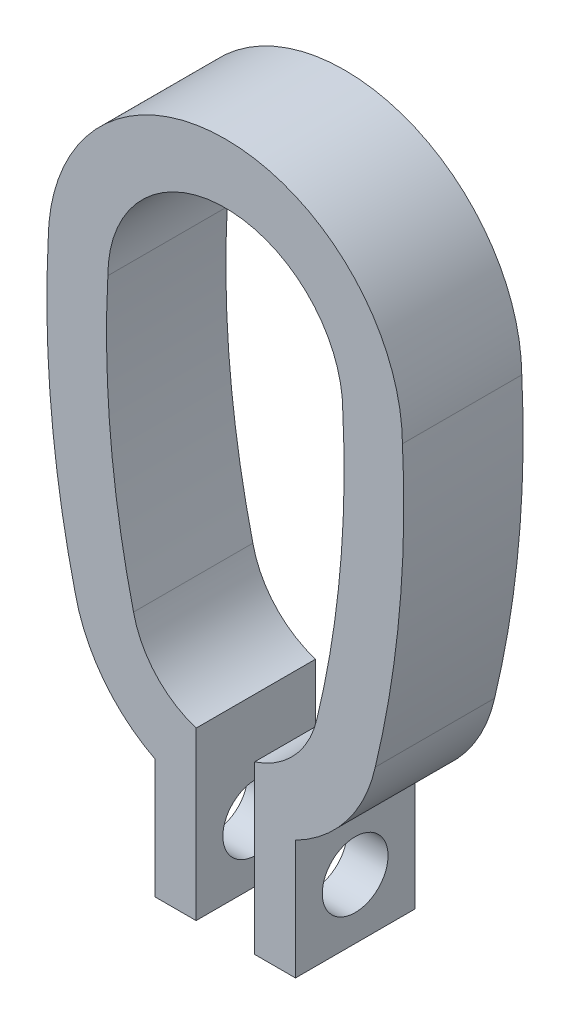
ISO-10303-21;
HEADER;
FILE_DESCRIPTION(('STEP AP214'),'2;1');
FILE_NAME('part.step','',(''),(''),'','','');
FILE_SCHEMA(('AUTOMOTIVE_DESIGN { 1 0 10303 214 1 1 1 1 }'));
ENDSEC;
DATA;
#1=APPLICATION_CONTEXT('core data for automotive mechanical design processes');
#2=APPLICATION_PROTOCOL_DEFINITION('international standard','automotive_design',2000,#1);
#3=PRODUCT_CONTEXT('',#1,'mechanical');
#4=PRODUCT('Part','Part','',(#3));
#5=PRODUCT_RELATED_PRODUCT_CATEGORY('part','',(#4));
#6=PRODUCT_DEFINITION_FORMATION('','',#4);
#7=PRODUCT_DEFINITION_CONTEXT('part definition',#1,'design');
#8=PRODUCT_DEFINITION('design','',#6,#7);
#9=PRODUCT_DEFINITION_SHAPE('','',#8);
#10=(LENGTH_UNIT() NAMED_UNIT(*) SI_UNIT(.MILLI.,.METRE.));
#11=(NAMED_UNIT(*) PLANE_ANGLE_UNIT() SI_UNIT($,.RADIAN.));
#12=(NAMED_UNIT(*) SI_UNIT($,.STERADIAN.) SOLID_ANGLE_UNIT());
#13=UNCERTAINTY_MEASURE_WITH_UNIT(LENGTH_MEASURE(1.E-05),#10,'distance_accuracy_value','');
#14=(GEOMETRIC_REPRESENTATION_CONTEXT(3) GLOBAL_UNCERTAINTY_ASSIGNED_CONTEXT((#13)) GLOBAL_UNIT_ASSIGNED_CONTEXT((#10,
#11,#12)) REPRESENTATION_CONTEXT('',''));
#15=CARTESIAN_POINT('',(0.,0.,0.));
#16=DIRECTION('',(0.,0.,1.));
#17=DIRECTION('',(1.,0.,0.));
#18=AXIS2_PLACEMENT_3D('',#15,#16,#17);
#19=CARTESIAN_POINT('',(0.,-27.4999999999599,12.7));
#20=DIRECTION('',(0.,0.,-1.));
#21=DIRECTION('',(-1.,0.,0.));
#22=AXIS2_PLACEMENT_3D('',#19,#20,#21);
#23=CYLINDRICAL_SURFACE('',#22,10.);
#24=CARTESIAN_POINT('',(0.,-27.4999999999599,0.));
#25=DIRECTION('',(0.,0.,-1.));
#26=DIRECTION('',(1.,0.,0.));
#27=AXIS2_PLACEMENT_3D('',#24,#25,#26);
#28=CIRCLE('',#27,10.);
#29=CARTESIAN_POINT('',(9.76853613803451,-29.639088992946,0.));
#30=VERTEX_POINT('',#29);
#31=CARTESIAN_POINT('',(3.1103074015303,-37.0039985199506,0.));
#32=VERTEX_POINT('',#31);
#33=EDGE_CURVE('E195',#30,#32,#28,.T.);
#34=ORIENTED_EDGE('',*,*,#33,.T.);
#35=DIRECTION('',(0.,0.,-1.));
#36=VECTOR('',#35,1.);
#37=CARTESIAN_POINT('',(3.1103074015303,-37.0039985199506,12.7));
#38=LINE('',#37,#36);
#39=CARTESIAN_POINT('',(3.1103074015303,-37.0039985199506,12.7));
#40=VERTEX_POINT('',#39);
#41=EDGE_CURVE('E11',#40,#32,#38,.T.);
#42=ORIENTED_EDGE('',*,*,#41,.F.);
#43=CARTESIAN_POINT('',(0.,-27.4999999999599,12.7));
#44=DIRECTION('',(0.,0.,-1.));
#45=DIRECTION('',(1.,0.,0.));
#46=AXIS2_PLACEMENT_3D('',#43,#44,#45);
#47=CIRCLE('',#46,10.);
#48=CARTESIAN_POINT('',(9.76853613803451,-29.639088992946,12.7));
#49=VERTEX_POINT('',#48);
#50=EDGE_CURVE('E242',#49,#40,#47,.T.);
#51=ORIENTED_EDGE('',*,*,#50,.F.);
#52=DIRECTION('',(0.,0.,-1.));
#53=VECTOR('',#52,1.);
#54=CARTESIAN_POINT('',(9.76853613803451,-29.639088992946,12.7));
#55=LINE('',#54,#53);
#56=EDGE_CURVE('E188',#49,#30,#55,.T.);
#57=ORIENTED_EDGE('',*,*,#56,.T.);
#58=EDGE_LOOP('',(#34,#42,#51,#57));
#59=FACE_BOUND('',#58,.T.);
#60=ADVANCED_FACE('F42',(#59),#23,.F.);
#61=CARTESIAN_POINT('',(3.1103074015303,-37.0039985199506,12.7));
#62=DIRECTION('',(1.,0.,0.));
#63=DIRECTION('',(0.,1.,0.));
#64=AXIS2_PLACEMENT_3D('',#61,#62,#63);
#65=PLANE('',#64);
#66=CARTESIAN_POINT('',(3.1103074015303,-48.3962280050505,6.35));
#67=DIRECTION('',(1.,0.,0.));
#68=DIRECTION('',(0.,1.,0.));
#69=AXIS2_PLACEMENT_3D('',#66,#67,#68);
#70=CIRCLE('',#69,3.499999985);
#71=CARTESIAN_POINT('',(3.1103074015303,-44.8962280200505,6.35));
#72=VERTEX_POINT('',#71);
#73=EDGE_CURVE('E200',#72,#72,#70,.T.);
#74=ORIENTED_EDGE('',*,*,#73,.T.);
#75=EDGE_LOOP('',(#74));
#76=FACE_BOUND('',#75,.T.);
#77=DIRECTION('',(0.,-1.,0.));
#78=VECTOR('',#77,1.);
#79=CARTESIAN_POINT('',(3.1103074015303,-37.0039985199506,0.));
#80=LINE('',#79,#78);
#81=CARTESIAN_POINT('',(3.11030740153029,-54.7462280050505,0.));
#82=VERTEX_POINT('',#81);
#83=EDGE_CURVE('E196',#32,#82,#80,.T.);
#84=ORIENTED_EDGE('',*,*,#83,.T.);
#85=DIRECTION('',(0.,0.,-1.));
#86=VECTOR('',#85,1.);
#87=CARTESIAN_POINT('',(3.11030740153029,-54.7462280050505,12.7));
#88=LINE('',#87,#86);
#89=CARTESIAN_POINT('',(3.11030740153029,-54.7462280050505,12.7));
#90=VERTEX_POINT('',#89);
#91=EDGE_CURVE('E53',#90,#82,#88,.T.);
#92=ORIENTED_EDGE('',*,*,#91,.F.);
#93=DIRECTION('',(0.,-1.,0.));
#94=VECTOR('',#93,1.);
#95=CARTESIAN_POINT('',(3.1103074015303,-37.0039985199506,12.7));
#96=LINE('',#95,#94);
#97=EDGE_CURVE('E129',#40,#90,#96,.T.);
#98=ORIENTED_EDGE('',*,*,#97,.F.);
#99=ORIENTED_EDGE('',*,*,#41,.T.);
#100=EDGE_LOOP('',(#84,#92,#98,#99));
#101=FACE_BOUND('',#100,.T.);
#102=ADVANCED_FACE('F365',(#76,#101),#65,.F.);
#103=CARTESIAN_POINT('',(3.11030740153029,-54.7462280050505,12.7));
#104=DIRECTION('',(0.,1.,0.));
#105=DIRECTION('',(0.,0.,1.));
#106=AXIS2_PLACEMENT_3D('',#103,#104,#105);
#107=PLANE('',#106);
#108=DIRECTION('',(1.,0.,0.));
#109=VECTOR('',#108,1.);
#110=CARTESIAN_POINT('',(3.11030740153029,-54.7462280050505,0.));
#111=LINE('',#110,#109);
#112=CARTESIAN_POINT('',(7.46523615325854,-54.7462280050505,0.));
#113=VERTEX_POINT('',#112);
#114=EDGE_CURVE('E205',#82,#113,#111,.T.);
#115=ORIENTED_EDGE('',*,*,#114,.T.);
#116=DIRECTION('',(0.,0.,-1.));
#117=VECTOR('',#116,1.);
#118=CARTESIAN_POINT('',(7.46523615325854,-54.7462280050505,12.7));
#119=LINE('',#118,#117);
#120=CARTESIAN_POINT('',(7.46523615325854,-54.7462280050505,12.7));
#121=VERTEX_POINT('',#120);
#122=EDGE_CURVE('E281',#121,#113,#119,.T.);
#123=ORIENTED_EDGE('',*,*,#122,.F.);
#124=DIRECTION('',(1.,0.,0.));
#125=VECTOR('',#124,1.);
#126=CARTESIAN_POINT('',(3.11030740153029,-54.7462280050505,12.7));
#127=LINE('',#126,#125);
#128=EDGE_CURVE('E293',#90,#121,#127,.T.);
#129=ORIENTED_EDGE('',*,*,#128,.F.);
#130=ORIENTED_EDGE('',*,*,#91,.T.);
#131=EDGE_LOOP('',(#115,#123,#129,#130));
#132=FACE_BOUND('',#131,.T.);
#133=ADVANCED_FACE('F291',(#132),#107,.F.);
#134=CARTESIAN_POINT('',(7.46523615325854,-54.7462280050505,12.7));
#135=DIRECTION('',(-1.,0.,0.));
#136=DIRECTION('',(0.,-1.,0.));
#137=AXIS2_PLACEMENT_3D('',#134,#135,#136);
#138=PLANE('',#137);
#139=CARTESIAN_POINT('',(7.46523615325854,-48.3962280050505,6.35));
#140=DIRECTION('',(1.,0.,0.));
#141=DIRECTION('',(0.,1.,0.));
#142=AXIS2_PLACEMENT_3D('',#139,#140,#141);
#143=CIRCLE('',#142,3.499999985);
#144=CARTESIAN_POINT('',(7.46523615325854,-44.8962280200505,6.35));
#145=VERTEX_POINT('',#144);
#146=EDGE_CURVE('E465',#145,#145,#143,.T.);
#147=ORIENTED_EDGE('',*,*,#146,.F.);
#148=EDGE_LOOP('',(#147));
#149=FACE_BOUND('',#148,.T.);
#150=DIRECTION('',(0.,1.,0.));
#151=VECTOR('',#150,1.);
#152=CARTESIAN_POINT('',(7.46523615325854,-54.7462280050505,0.));
#153=LINE('',#152,#151);
#154=CARTESIAN_POINT('',(7.46523615325853,-42.0462280050505,0.));
#155=VERTEX_POINT('',#154);
#156=EDGE_CURVE('E202',#113,#155,#153,.T.);
#157=ORIENTED_EDGE('',*,*,#156,.T.);
#158=DIRECTION('',(0.,0.,-1.));
#159=VECTOR('',#158,1.);
#160=CARTESIAN_POINT('',(7.46523615325853,-42.0462280050505,12.7));
#161=LINE('',#160,#159);
#162=CARTESIAN_POINT('',(7.46523615325853,-42.0462280050505,12.7));
#163=VERTEX_POINT('',#162);
#164=EDGE_CURVE('E278',#163,#155,#161,.T.);
#165=ORIENTED_EDGE('',*,*,#164,.F.);
#166=DIRECTION('',(0.,1.,0.));
#167=VECTOR('',#166,1.);
#168=CARTESIAN_POINT('',(7.46523615325854,-54.7462280050505,12.7));
#169=LINE('',#168,#167);
#170=EDGE_CURVE('E314',#121,#163,#169,.T.);
#171=ORIENTED_EDGE('',*,*,#170,.F.);
#172=ORIENTED_EDGE('',*,*,#122,.T.);
#173=EDGE_LOOP('',(#157,#165,#171,#172));
#174=FACE_BOUND('',#173,.T.);
#175=ADVANCED_FACE('F305',(#149,#174),#138,.F.);
#176=CARTESIAN_POINT('',(0.,-27.4999999999599,12.7));
#177=DIRECTION('',(0.,0.,-1.));
#178=DIRECTION('',(-1.,0.,0.));
#179=AXIS2_PLACEMENT_3D('',#176,#177,#178);
#180=CYLINDRICAL_SURFACE('',#179,16.35);
#181=CARTESIAN_POINT('',(0.,-27.4999999999599,0.));
#182=DIRECTION('',(0.,0.,1.));
#183=DIRECTION('',(1.,0.,0.));
#184=AXIS2_PLACEMENT_3D('',#181,#182,#183);
#185=CIRCLE('',#184,16.35);
#186=CARTESIAN_POINT('',(15.9560828435937,-31.0673407866491,0.));
#187=VERTEX_POINT('',#186);
#188=EDGE_CURVE('E208',#155,#187,#185,.T.);
#189=ORIENTED_EDGE('',*,*,#188,.T.);
#190=DIRECTION('',(0.,0.,-1.));
#191=VECTOR('',#190,1.);
#192=CARTESIAN_POINT('',(15.9560828435937,-31.0673407866491,12.7));
#193=LINE('',#192,#191);
#194=CARTESIAN_POINT('',(15.9560828435937,-31.0673407866491,12.7));
#195=VERTEX_POINT('',#194);
#196=EDGE_CURVE('E277',#195,#187,#193,.T.);
#197=ORIENTED_EDGE('',*,*,#196,.F.);
#198=CARTESIAN_POINT('',(0.,-27.4999999999599,12.7));
#199=DIRECTION('',(0.,0.,1.));
#200=DIRECTION('',(1.,0.,0.));
#201=AXIS2_PLACEMENT_3D('',#198,#199,#200);
#202=CIRCLE('',#201,16.35);
#203=EDGE_CURVE('E309',#163,#195,#202,.T.);
#204=ORIENTED_EDGE('',*,*,#203,.F.);
#205=ORIENTED_EDGE('',*,*,#164,.T.);
#206=EDGE_LOOP('',(#189,#197,#204,#205));
#207=FACE_BOUND('',#206,.T.);
#208=ADVANCED_FACE('F306',(#207),#180,.T.);
#209=CARTESIAN_POINT('',(-91.0364026495912,-5.40375257091586,12.7));
#210=DIRECTION('',(0.,0.,-1.));
#211=DIRECTION('',(-1.,0.,0.));
#212=AXIS2_PLACEMENT_3D('',#209,#210,#211);
#213=CYLINDRICAL_SURFACE('',#212,110.027322570878);
#214=CARTESIAN_POINT('',(-91.0364026495912,-5.40375257091586,0.));
#215=DIRECTION('',(0.,0.,1.));
#216=DIRECTION('',(-1.,0.,0.));
#217=AXIS2_PLACEMENT_3D('',#214,#215,#216);
#218=CIRCLE('',#217,110.027322570878);
#219=CARTESIAN_POINT('',(18.8491397086616,0.180089542606383,0.));
#220=VERTEX_POINT('',#219);
#221=EDGE_CURVE('E211',#187,#220,#218,.T.);
#222=ORIENTED_EDGE('',*,*,#221,.T.);
#223=DIRECTION('',(0.,0.,-1.));
#224=VECTOR('',#223,1.);
#225=CARTESIAN_POINT('',(18.8491397086616,0.180089542606383,12.7));
#226=LINE('',#225,#224);
#227=CARTESIAN_POINT('',(18.8491397086616,0.180089542606383,12.7));
#228=VERTEX_POINT('',#227);
#229=EDGE_CURVE('E275',#228,#220,#226,.T.);
#230=ORIENTED_EDGE('',*,*,#229,.F.);
#231=CARTESIAN_POINT('',(-91.0364026495912,-5.40375257091586,12.7));
#232=DIRECTION('',(0.,0.,1.));
#233=DIRECTION('',(-1.,0.,0.));
#234=AXIS2_PLACEMENT_3D('',#231,#232,#233);
#235=CIRCLE('',#234,110.027322570878);
#236=EDGE_CURVE('E311',#195,#228,#235,.T.);
#237=ORIENTED_EDGE('',*,*,#236,.F.);
#238=ORIENTED_EDGE('',*,*,#196,.T.);
#239=EDGE_LOOP('',(#222,#230,#237,#238));
#240=FACE_BOUND('',#239,.T.);
#241=ADVANCED_FACE('F381',(#240),#213,.T.);
#242=CARTESIAN_POINT('',(0.,0.,12.7));
#243=DIRECTION('',(0.,0.,-1.));
#244=DIRECTION('',(-1.,0.,0.));
#245=AXIS2_PLACEMENT_3D('',#242,#243,#244);
#246=CYLINDRICAL_SURFACE('',#245,18.85);
#247=CARTESIAN_POINT('',(0.,0.,0.));
#248=DIRECTION('',(0.,0.,1.));
#249=DIRECTION('',(1.,0.,0.));
#250=AXIS2_PLACEMENT_3D('',#247,#248,#249);
#251=CIRCLE('',#250,18.85);
#252=CARTESIAN_POINT('',(-18.8491397086616,0.180089542604985,0.));
#253=VERTEX_POINT('',#252);
#254=EDGE_CURVE('E212',#220,#253,#251,.T.);
#255=ORIENTED_EDGE('',*,*,#254,.T.);
#256=DIRECTION('',(0.,0.,-1.));
#257=VECTOR('',#256,1.);
#258=CARTESIAN_POINT('',(-18.8491397086616,0.180089542604985,12.7));
#259=LINE('',#258,#257);
#260=CARTESIAN_POINT('',(-18.8491397086616,0.180089542604985,12.7));
#261=VERTEX_POINT('',#260);
#262=EDGE_CURVE('E268',#261,#253,#259,.T.);
#263=ORIENTED_EDGE('',*,*,#262,.F.);
#264=CARTESIAN_POINT('',(0.,0.,12.7));
#265=DIRECTION('',(0.,0.,1.));
#266=DIRECTION('',(1.,0.,0.));
#267=AXIS2_PLACEMENT_3D('',#264,#265,#266);
#268=CIRCLE('',#267,18.85);
#269=EDGE_CURVE('E318',#228,#261,#268,.T.);
#270=ORIENTED_EDGE('',*,*,#269,.F.);
#271=ORIENTED_EDGE('',*,*,#229,.T.);
#272=EDGE_LOOP('',(#255,#263,#270,#271));
#273=FACE_BOUND('',#272,.T.);
#274=ADVANCED_FACE('F383',(#273),#246,.T.);
#275=CARTESIAN_POINT('',(91.0364026495912,-5.40375257091582,12.7));
#276=DIRECTION('',(0.,0.,-1.));
#277=DIRECTION('',(-1.,0.,0.));
#278=AXIS2_PLACEMENT_3D('',#275,#276,#277);
#279=CYLINDRICAL_SURFACE('',#278,110.027322570878);
#280=CARTESIAN_POINT('',(91.0364026495912,-5.40375257091582,0.));
#281=DIRECTION('',(0.,0.,1.));
#282=DIRECTION('',(1.,0.,0.));
#283=AXIS2_PLACEMENT_3D('',#280,#281,#282);
#284=CIRCLE('',#283,110.027322570878);
#285=CARTESIAN_POINT('',(-15.9560828435952,-31.0673407866425,0.));
#286=VERTEX_POINT('',#285);
#287=EDGE_CURVE('E220',#253,#286,#284,.T.);
#288=ORIENTED_EDGE('',*,*,#287,.T.);
#289=DIRECTION('',(0.,0.,-1.));
#290=VECTOR('',#289,1.);
#291=CARTESIAN_POINT('',(-15.9560828435952,-31.0673407866425,12.7));
#292=LINE('',#291,#290);
#293=CARTESIAN_POINT('',(-15.9560828435952,-31.0673407866425,12.7));
#294=VERTEX_POINT('',#293);
#295=EDGE_CURVE('E262',#294,#286,#292,.T.);
#296=ORIENTED_EDGE('',*,*,#295,.F.);
#297=CARTESIAN_POINT('',(91.0364026495912,-5.40375257091582,12.7));
#298=DIRECTION('',(0.,0.,1.));
#299=DIRECTION('',(1.,0.,0.));
#300=AXIS2_PLACEMENT_3D('',#297,#298,#299);
#301=CIRCLE('',#300,110.027322570878);
#302=EDGE_CURVE('E324',#261,#294,#301,.T.);
#303=ORIENTED_EDGE('',*,*,#302,.F.);
#304=ORIENTED_EDGE('',*,*,#262,.T.);
#305=EDGE_LOOP('',(#288,#296,#303,#304));
#306=FACE_BOUND('',#305,.T.);
#307=ADVANCED_FACE('F389',(#306),#279,.T.);
#308=CARTESIAN_POINT('',(0.,-27.4999999999599,12.7));
#309=DIRECTION('',(0.,0.,-1.));
#310=DIRECTION('',(-1.,0.,0.));
#311=AXIS2_PLACEMENT_3D('',#308,#309,#310);
#312=CYLINDRICAL_SURFACE('',#311,16.3500000000001);
#313=CARTESIAN_POINT('',(0.,-27.4999999999599,0.));
#314=DIRECTION('',(0.,0.,1.));
#315=DIRECTION('',(1.,0.,0.));
#316=AXIS2_PLACEMENT_3D('',#313,#314,#315);
#317=CIRCLE('',#316,16.3500000000001);
#318=CARTESIAN_POINT('',(-7.46523615327629,-42.0462280050414,0.));
#319=VERTEX_POINT('',#318);
#320=EDGE_CURVE('E219',#286,#319,#317,.T.);
#321=ORIENTED_EDGE('',*,*,#320,.T.);
#322=DIRECTION('',(0.,0.,-1.));
#323=VECTOR('',#322,1.);
#324=CARTESIAN_POINT('',(-7.46523615327629,-42.0462280050414,12.7));
#325=LINE('',#324,#323);
#326=CARTESIAN_POINT('',(-7.46523615327629,-42.0462280050414,12.7));
#327=VERTEX_POINT('',#326);
#328=EDGE_CURVE('E257',#327,#319,#325,.T.);
#329=ORIENTED_EDGE('',*,*,#328,.F.);
#330=CARTESIAN_POINT('',(0.,-27.4999999999599,12.7));
#331=DIRECTION('',(0.,0.,1.));
#332=DIRECTION('',(1.,0.,0.));
#333=AXIS2_PLACEMENT_3D('',#330,#331,#332);
#334=CIRCLE('',#333,16.3500000000001);
#335=EDGE_CURVE('E327',#294,#327,#334,.T.);
#336=ORIENTED_EDGE('',*,*,#335,.F.);
#337=ORIENTED_EDGE('',*,*,#295,.T.);
#338=EDGE_LOOP('',(#321,#329,#336,#337));
#339=FACE_BOUND('',#338,.T.);
#340=ADVANCED_FACE('F395',(#339),#312,.T.);
#341=CARTESIAN_POINT('',(-7.46523615327631,-54.7462280050505,12.7));
#342=DIRECTION('',(1.,0.,0.));
#343=DIRECTION('',(0.,1.,0.));
#344=AXIS2_PLACEMENT_3D('',#341,#342,#343);
#345=PLANE('',#344);
#346=CARTESIAN_POINT('',(-7.46523615327629,-48.3962280050505,6.35));
#347=DIRECTION('',(1.,0.,0.));
#348=DIRECTION('',(0.,1.,0.));
#349=AXIS2_PLACEMENT_3D('',#346,#347,#348);
#350=CIRCLE('',#349,3.499999985);
#351=CARTESIAN_POINT('',(-7.46523615327629,-44.8962280200505,6.35));
#352=VERTEX_POINT('',#351);
#353=EDGE_CURVE('E463',#352,#352,#350,.T.);
#354=ORIENTED_EDGE('',*,*,#353,.T.);
#355=EDGE_LOOP('',(#354));
#356=FACE_BOUND('',#355,.T.);
#357=DIRECTION('',(0.,-1.,0.));
#358=VECTOR('',#357,1.);
#359=CARTESIAN_POINT('',(-7.46523615327631,-54.7462280050505,0.));
#360=LINE('',#359,#358);
#361=CARTESIAN_POINT('',(-7.46523615327631,-54.7462280050505,0.));
#362=VERTEX_POINT('',#361);
#363=EDGE_CURVE('E224',#319,#362,#360,.T.);
#364=ORIENTED_EDGE('',*,*,#363,.T.);
#365=DIRECTION('',(0.,0.,-1.));
#366=VECTOR('',#365,1.);
#367=CARTESIAN_POINT('',(-7.46523615327631,-54.7462280050505,12.7));
#368=LINE('',#367,#366);
#369=CARTESIAN_POINT('',(-7.46523615327631,-54.7462280050505,12.7));
#370=VERTEX_POINT('',#369);
#371=EDGE_CURVE('E258',#370,#362,#368,.T.);
#372=ORIENTED_EDGE('',*,*,#371,.F.);
#373=DIRECTION('',(0.,-1.,0.));
#374=VECTOR('',#373,1.);
#375=CARTESIAN_POINT('',(-7.46523615327631,-54.7462280050505,12.7));
#376=LINE('',#375,#374);
#377=EDGE_CURVE('E332',#327,#370,#376,.T.);
#378=ORIENTED_EDGE('',*,*,#377,.F.);
#379=ORIENTED_EDGE('',*,*,#328,.T.);
#380=EDGE_LOOP('',(#364,#372,#378,#379));
#381=FACE_BOUND('',#380,.T.);
#382=ADVANCED_FACE('F398',(#356,#381),#345,.F.);
#383=CARTESIAN_POINT('',(-3.11030740154215,-54.7462280050505,12.7));
#384=DIRECTION('',(0.,1.,0.));
#385=DIRECTION('',(0.,0.,1.));
#386=AXIS2_PLACEMENT_3D('',#383,#384,#385);
#387=PLANE('',#386);
#388=DIRECTION('',(1.,0.,0.));
#389=VECTOR('',#388,1.);
#390=CARTESIAN_POINT('',(-3.11030740154215,-54.7462280050505,0.));
#391=LINE('',#390,#389);
#392=CARTESIAN_POINT('',(-3.11030740154215,-54.7462280050505,0.));
#393=VERTEX_POINT('',#392);
#394=EDGE_CURVE('E227',#362,#393,#391,.T.);
#395=ORIENTED_EDGE('',*,*,#394,.T.);
#396=DIRECTION('',(0.,0.,-1.));
#397=VECTOR('',#396,1.);
#398=CARTESIAN_POINT('',(-3.11030740154215,-54.7462280050505,12.7));
#399=LINE('',#398,#397);
#400=CARTESIAN_POINT('',(-3.11030740154215,-54.7462280050505,12.7));
#401=VERTEX_POINT('',#400);
#402=EDGE_CURVE('E252',#401,#393,#399,.T.);
#403=ORIENTED_EDGE('',*,*,#402,.F.);
#404=DIRECTION('',(1.,0.,0.));
#405=VECTOR('',#404,1.);
#406=CARTESIAN_POINT('',(-3.11030740154215,-54.7462280050505,12.7));
#407=LINE('',#406,#405);
#408=EDGE_CURVE('E331',#370,#401,#407,.T.);
#409=ORIENTED_EDGE('',*,*,#408,.F.);
#410=ORIENTED_EDGE('',*,*,#371,.T.);
#411=EDGE_LOOP('',(#395,#403,#409,#410));
#412=FACE_BOUND('',#411,.T.);
#413=ADVANCED_FACE('F396',(#412),#387,.F.);
#414=CARTESIAN_POINT('',(-3.11030740154213,-37.0039985199467,12.7));
#415=DIRECTION('',(-1.,0.,0.));
#416=DIRECTION('',(0.,-1.,0.));
#417=AXIS2_PLACEMENT_3D('',#414,#415,#416);
#418=PLANE('',#417);
#419=CARTESIAN_POINT('',(-3.11030740154215,-48.3962280050505,6.35));
#420=DIRECTION('',(-1.,0.,0.));
#421=DIRECTION('',(0.,-1.,0.));
#422=AXIS2_PLACEMENT_3D('',#419,#420,#421);
#423=CIRCLE('',#422,3.499999985);
#424=CARTESIAN_POINT('',(-3.11030740154216,-51.8962279900505,6.35));
#425=VERTEX_POINT('',#424);
#426=EDGE_CURVE('E50',#425,#425,#423,.T.);
#427=ORIENTED_EDGE('',*,*,#426,.T.);
#428=EDGE_LOOP('',(#427));
#429=FACE_BOUND('',#428,.T.);
#430=DIRECTION('',(0.,1.,0.));
#431=VECTOR('',#430,1.);
#432=CARTESIAN_POINT('',(-3.11030740154213,-37.0039985199467,0.));
#433=LINE('',#432,#431);
#434=CARTESIAN_POINT('',(-3.11030740154214,-37.0039985199467,0.));
#435=VERTEX_POINT('',#434);
#436=EDGE_CURVE('E226',#393,#435,#433,.T.);
#437=ORIENTED_EDGE('',*,*,#436,.T.);
#438=DIRECTION('',(0.,0.,-1.));
#439=VECTOR('',#438,1.);
#440=CARTESIAN_POINT('',(-3.11030740154214,-37.0039985199467,12.7));
#441=LINE('',#440,#439);
#442=CARTESIAN_POINT('',(-3.11030740154214,-37.0039985199467,12.7));
#443=VERTEX_POINT('',#442);
#444=EDGE_CURVE('E247',#443,#435,#441,.T.);
#445=ORIENTED_EDGE('',*,*,#444,.F.);
#446=DIRECTION('',(0.,1.,0.));
#447=VECTOR('',#446,1.);
#448=CARTESIAN_POINT('',(-3.11030740154213,-37.0039985199467,12.7));
#449=LINE('',#448,#447);
#450=EDGE_CURVE('E340',#401,#443,#449,.T.);
#451=ORIENTED_EDGE('',*,*,#450,.F.);
#452=ORIENTED_EDGE('',*,*,#402,.T.);
#453=EDGE_LOOP('',(#437,#445,#451,#452));
#454=FACE_BOUND('',#453,.T.);
#455=ADVANCED_FACE('F341',(#429,#454),#418,.F.);
#456=CARTESIAN_POINT('',(0.,-27.4999999999599,12.7));
#457=DIRECTION('',(0.,0.,-1.));
#458=DIRECTION('',(-1.,0.,0.));
#459=AXIS2_PLACEMENT_3D('',#456,#457,#458);
#460=CYLINDRICAL_SURFACE('',#459,10.);
#461=CARTESIAN_POINT('',(0.,-27.4999999999599,0.));
#462=DIRECTION('',(0.,0.,-1.));
#463=DIRECTION('',(1.,0.,0.));
#464=AXIS2_PLACEMENT_3D('',#461,#462,#463);
#465=CIRCLE('',#464,10.);
#466=CARTESIAN_POINT('',(-9.7685361380345,-29.639088992946,0.));
#467=VERTEX_POINT('',#466);
#468=EDGE_CURVE('E234',#435,#467,#465,.T.);
#469=ORIENTED_EDGE('',*,*,#468,.T.);
#470=DIRECTION('',(0.,0.,-1.));
#471=VECTOR('',#470,1.);
#472=CARTESIAN_POINT('',(-9.7685361380345,-29.639088992946,12.7));
#473=LINE('',#472,#471);
#474=CARTESIAN_POINT('',(-9.7685361380345,-29.639088992946,12.7));
#475=VERTEX_POINT('',#474);
#476=EDGE_CURVE('E181',#475,#467,#473,.T.);
#477=ORIENTED_EDGE('',*,*,#476,.F.);
#478=CARTESIAN_POINT('',(0.,-27.4999999999599,12.7));
#479=DIRECTION('',(0.,0.,-1.));
#480=DIRECTION('',(1.,0.,0.));
#481=AXIS2_PLACEMENT_3D('',#478,#479,#480);
#482=CIRCLE('',#481,10.);
#483=EDGE_CURVE('E175',#443,#475,#482,.T.);
#484=ORIENTED_EDGE('',*,*,#483,.F.);
#485=ORIENTED_EDGE('',*,*,#444,.T.);
#486=EDGE_LOOP('',(#469,#477,#484,#485));
#487=FACE_BOUND('',#486,.T.);
#488=ADVANCED_FACE('F349',(#487),#460,.F.);
#489=CARTESIAN_POINT('',(91.0364026495912,-5.40375257091582,12.7));
#490=DIRECTION('',(0.,0.,-1.));
#491=DIRECTION('',(-1.,0.,0.));
#492=AXIS2_PLACEMENT_3D('',#489,#490,#491);
#493=CYLINDRICAL_SURFACE('',#492,103.677322570878);
#494=CARTESIAN_POINT('',(91.0364026495912,-5.40375257091582,0.));
#495=DIRECTION('',(0.,0.,-1.));
#496=DIRECTION('',(1.,0.,0.));
#497=AXIS2_PLACEMENT_3D('',#494,#495,#496);
#498=CIRCLE('',#497,103.677322570878);
#499=CARTESIAN_POINT('',(-12.5,0.,0.));
#500=VERTEX_POINT('',#499);
#501=EDGE_CURVE('E182',#467,#500,#498,.T.);
#502=ORIENTED_EDGE('',*,*,#501,.T.);
#503=DIRECTION('',(0.,0.,-1.));
#504=VECTOR('',#503,1.);
#505=CARTESIAN_POINT('',(-12.5,0.,12.7));
#506=LINE('',#505,#504);
#507=CARTESIAN_POINT('',(-12.5,0.,12.7));
#508=VERTEX_POINT('',#507);
#509=EDGE_CURVE('E177',#508,#500,#506,.T.);
#510=ORIENTED_EDGE('',*,*,#509,.F.);
#511=CARTESIAN_POINT('',(91.0364026495912,-5.40375257091582,12.7));
#512=DIRECTION('',(0.,0.,-1.));
#513=DIRECTION('',(1.,0.,0.));
#514=AXIS2_PLACEMENT_3D('',#511,#512,#513);
#515=CIRCLE('',#514,103.677322570878);
#516=EDGE_CURVE('E167',#475,#508,#515,.T.);
#517=ORIENTED_EDGE('',*,*,#516,.F.);
#518=ORIENTED_EDGE('',*,*,#476,.T.);
#519=EDGE_LOOP('',(#502,#510,#517,#518));
#520=FACE_BOUND('',#519,.T.);
#521=ADVANCED_FACE('F180',(#520),#493,.F.);
#522=CARTESIAN_POINT('',(0.,0.,12.7));
#523=DIRECTION('',(0.,0.,-1.));
#524=DIRECTION('',(-1.,0.,0.));
#525=AXIS2_PLACEMENT_3D('',#522,#523,#524);
#526=CYLINDRICAL_SURFACE('',#525,12.5);
#527=CARTESIAN_POINT('',(0.,0.,0.));
#528=DIRECTION('',(0.,0.,-1.));
#529=DIRECTION('',(1.,0.,0.));
#530=AXIS2_PLACEMENT_3D('',#527,#528,#529);
#531=CIRCLE('',#530,12.5);
#532=CARTESIAN_POINT('',(12.5,0.,0.));
#533=VERTEX_POINT('',#532);
#534=EDGE_CURVE('E113',#500,#533,#531,.T.);
#535=ORIENTED_EDGE('',*,*,#534,.T.);
#536=DIRECTION('',(0.,0.,-1.));
#537=VECTOR('',#536,1.);
#538=CARTESIAN_POINT('',(12.5,0.,12.7));
#539=LINE('',#538,#537);
#540=CARTESIAN_POINT('',(12.5,0.,12.7));
#541=VERTEX_POINT('',#540);
#542=EDGE_CURVE('E184',#541,#533,#539,.T.);
#543=ORIENTED_EDGE('',*,*,#542,.F.);
#544=CARTESIAN_POINT('',(0.,0.,12.7));
#545=DIRECTION('',(0.,0.,-1.));
#546=DIRECTION('',(1.,0.,0.));
#547=AXIS2_PLACEMENT_3D('',#544,#545,#546);
#548=CIRCLE('',#547,12.5);
#549=EDGE_CURVE('E168',#508,#541,#548,.T.);
#550=ORIENTED_EDGE('',*,*,#549,.F.);
#551=ORIENTED_EDGE('',*,*,#509,.T.);
#552=EDGE_LOOP('',(#535,#543,#550,#551));
#553=FACE_BOUND('',#552,.T.);
#554=ADVANCED_FACE('F187',(#553),#526,.F.);
#555=CARTESIAN_POINT('',(-91.0364026495912,-5.40375257091586,12.7));
#556=DIRECTION('',(0.,0.,-1.));
#557=DIRECTION('',(-1.,0.,0.));
#558=AXIS2_PLACEMENT_3D('',#555,#556,#557);
#559=CYLINDRICAL_SURFACE('',#558,103.677322570878);
#560=CARTESIAN_POINT('',(-91.0364026495912,-5.40375257091586,0.));
#561=DIRECTION('',(0.,0.,-1.));
#562=DIRECTION('',(-1.,0.,0.));
#563=AXIS2_PLACEMENT_3D('',#560,#561,#562);
#564=CIRCLE('',#563,103.677322570878);
#565=EDGE_CURVE('E123',#533,#30,#564,.T.);
#566=ORIENTED_EDGE('',*,*,#565,.T.);
#567=ORIENTED_EDGE('',*,*,#56,.F.);
#568=CARTESIAN_POINT('',(-91.0364026495912,-5.40375257091586,12.7));
#569=DIRECTION('',(0.,0.,-1.));
#570=DIRECTION('',(-1.,0.,0.));
#571=AXIS2_PLACEMENT_3D('',#568,#569,#570);
#572=CIRCLE('',#571,103.677322570878);
#573=EDGE_CURVE('E65',#541,#49,#572,.T.);
#574=ORIENTED_EDGE('',*,*,#573,.F.);
#575=ORIENTED_EDGE('',*,*,#542,.T.);
#576=EDGE_LOOP('',(#566,#567,#574,#575));
#577=FACE_BOUND('',#576,.T.);
#578=ADVANCED_FACE('F354',(#577),#559,.F.);
#579=CARTESIAN_POINT('',(0.,-27.4999999999599,12.7));
#580=DIRECTION('',(0.,0.,1.));
#581=DIRECTION('',(1.,0.,0.));
#582=AXIS2_PLACEMENT_3D('',#579,#580,#581);
#583=PLANE('',#582);
#584=ORIENTED_EDGE('',*,*,#50,.T.);
#585=ORIENTED_EDGE('',*,*,#97,.T.);
#586=ORIENTED_EDGE('',*,*,#128,.T.);
#587=ORIENTED_EDGE('',*,*,#170,.T.);
#588=ORIENTED_EDGE('',*,*,#203,.T.);
#589=ORIENTED_EDGE('',*,*,#236,.T.);
#590=ORIENTED_EDGE('',*,*,#269,.T.);
#591=ORIENTED_EDGE('',*,*,#302,.T.);
#592=ORIENTED_EDGE('',*,*,#335,.T.);
#593=ORIENTED_EDGE('',*,*,#377,.T.);
#594=ORIENTED_EDGE('',*,*,#408,.T.);
#595=ORIENTED_EDGE('',*,*,#450,.T.);
#596=ORIENTED_EDGE('',*,*,#483,.T.);
#597=ORIENTED_EDGE('',*,*,#516,.T.);
#598=ORIENTED_EDGE('',*,*,#549,.T.);
#599=ORIENTED_EDGE('',*,*,#573,.T.);
#600=EDGE_LOOP('',(#584,#585,#586,#587,#588,#589,#590,#591,#592,#593,#594,#595,#596,#597,#598,#599));
#601=FACE_BOUND('',#600,.T.);
#602=ADVANCED_FACE('F169',(#601),#583,.T.);
#603=CARTESIAN_POINT('',(0.,-27.4999999999599,0.));
#604=DIRECTION('',(0.,0.,1.));
#605=DIRECTION('',(1.,0.,0.));
#606=AXIS2_PLACEMENT_3D('',#603,#604,#605);
#607=PLANE('',#606);
#608=ORIENTED_EDGE('',*,*,#33,.F.);
#609=ORIENTED_EDGE('',*,*,#565,.F.);
#610=ORIENTED_EDGE('',*,*,#534,.F.);
#611=ORIENTED_EDGE('',*,*,#501,.F.);
#612=ORIENTED_EDGE('',*,*,#468,.F.);
#613=ORIENTED_EDGE('',*,*,#436,.F.);
#614=ORIENTED_EDGE('',*,*,#394,.F.);
#615=ORIENTED_EDGE('',*,*,#363,.F.);
#616=ORIENTED_EDGE('',*,*,#320,.F.);
#617=ORIENTED_EDGE('',*,*,#287,.F.);
#618=ORIENTED_EDGE('',*,*,#254,.F.);
#619=ORIENTED_EDGE('',*,*,#221,.F.);
#620=ORIENTED_EDGE('',*,*,#188,.F.);
#621=ORIENTED_EDGE('',*,*,#156,.F.);
#622=ORIENTED_EDGE('',*,*,#114,.F.);
#623=ORIENTED_EDGE('',*,*,#83,.F.);
#624=EDGE_LOOP('',(#608,#609,#610,#611,#612,#613,#614,#615,#616,#617,#618,#619,#620,#621,#622,#623));
#625=FACE_BOUND('',#624,.T.);
#626=ADVANCED_FACE('F296',(#625),#607,.F.);
#627=CARTESIAN_POINT('',(-119.534763846741,-48.3962280050506,6.35));
#628=DIRECTION('',(1.,0.,0.));
#629=DIRECTION('',(0.,1.,0.));
#630=AXIS2_PLACEMENT_3D('',#627,#628,#629);
#631=CYLINDRICAL_SURFACE('',#630,3.499999985);
#632=ORIENTED_EDGE('',*,*,#426,.F.);
#633=EDGE_LOOP('',(#632));
#634=FACE_BOUND('',#633,.T.);
#635=ORIENTED_EDGE('',*,*,#353,.F.);
#636=EDGE_LOOP('',(#635));
#637=FACE_BOUND('',#636,.T.);
#638=ADVANCED_FACE('F438',(#634,#637),#631,.F.);
#639=ORIENTED_EDGE('',*,*,#146,.T.);
#640=EDGE_LOOP('',(#639));
#641=FACE_BOUND('',#640,.T.);
#642=ORIENTED_EDGE('',*,*,#73,.F.);
#643=EDGE_LOOP('',(#642));
#644=FACE_BOUND('',#643,.T.);
#645=ADVANCED_FACE('F450',(#641,#644),#631,.F.);
#646=CLOSED_SHELL('',(#60,#102,#133,#175,#208,#241,#274,#307,#340,#382,#413,#455,#488,#521,#554,
#578,#602,#626,#638,#645));
#647=MANIFOLD_SOLID_BREP('B2',#646);
#648=ADVANCED_BREP_SHAPE_REPRESENTATION('',(#18,#647),#14);
#649=SHAPE_DEFINITION_REPRESENTATION(#9,#648);
ENDSEC;
END-ISO-10303-21;
